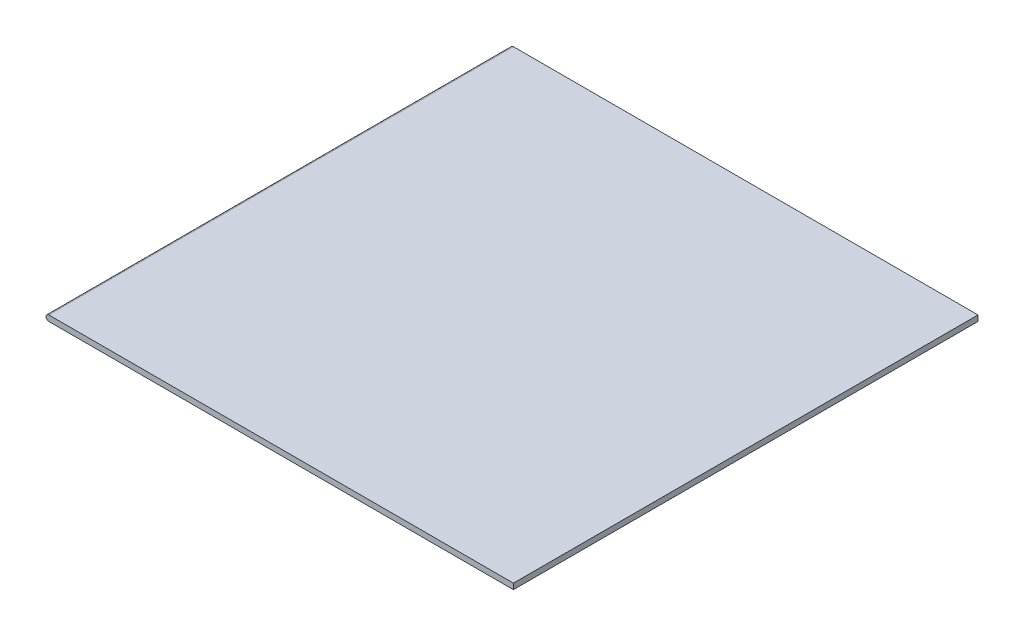
ISO-10303-21;
HEADER;
FILE_DESCRIPTION(('STEP AP214'),'2;1');
FILE_NAME('part.step','',(''),(''),'','','');
FILE_SCHEMA(('AUTOMOTIVE_DESIGN { 1 0 10303 214 1 1 1 1 }'));
ENDSEC;
DATA;
#1=APPLICATION_CONTEXT('core data for automotive mechanical design processes');
#2=APPLICATION_PROTOCOL_DEFINITION('international standard','automotive_design',2000,#1);
#3=PRODUCT_CONTEXT('',#1,'mechanical');
#4=PRODUCT('Part','Part','',(#3));
#5=PRODUCT_RELATED_PRODUCT_CATEGORY('part','',(#4));
#6=PRODUCT_DEFINITION_FORMATION('','',#4);
#7=PRODUCT_DEFINITION_CONTEXT('part definition',#1,'design');
#8=PRODUCT_DEFINITION('design','',#6,#7);
#9=PRODUCT_DEFINITION_SHAPE('','',#8);
#10=(LENGTH_UNIT() NAMED_UNIT(*) SI_UNIT(.MILLI.,.METRE.));
#11=(NAMED_UNIT(*) PLANE_ANGLE_UNIT() SI_UNIT($,.RADIAN.));
#12=(NAMED_UNIT(*) SI_UNIT($,.STERADIAN.) SOLID_ANGLE_UNIT());
#13=UNCERTAINTY_MEASURE_WITH_UNIT(LENGTH_MEASURE(1.E-05),#10,'distance_accuracy_value','');
#14=(GEOMETRIC_REPRESENTATION_CONTEXT(3) GLOBAL_UNCERTAINTY_ASSIGNED_CONTEXT((#13)) GLOBAL_UNIT_ASSIGNED_CONTEXT((#10,
#11,#12)) REPRESENTATION_CONTEXT('',''));
#15=CARTESIAN_POINT('',(0.,0.,0.));
#16=DIRECTION('',(0.,0.,1.));
#17=DIRECTION('',(1.,0.,0.));
#18=AXIS2_PLACEMENT_3D('',#15,#16,#17);
#19=CARTESIAN_POINT('',(205.,5.,205.));
#20=DIRECTION('',(-1.,0.,0.));
#21=DIRECTION('',(0.,0.,1.));
#22=AXIS2_PLACEMENT_3D('',#19,#20,#21);
#23=PLANE('',#22);
#24=DIRECTION('',(0.,0.,-1.));
#25=VECTOR('',#24,1.);
#26=CARTESIAN_POINT('',(205.,0.,205.));
#27=LINE('',#26,#25);
#28=CARTESIAN_POINT('',(205.,0.,205.));
#29=VERTEX_POINT('',#28);
#30=CARTESIAN_POINT('',(205.,0.,-205.));
#31=VERTEX_POINT('',#30);
#32=EDGE_CURVE('E92',#29,#31,#27,.T.);
#33=ORIENTED_EDGE('',*,*,#32,.T.);
#34=DIRECTION('',(0.,-1.,0.));
#35=VECTOR('',#34,1.);
#36=CARTESIAN_POINT('',(205.,5.,-205.));
#37=LINE('',#36,#35);
#38=CARTESIAN_POINT('',(205.,5.,-205.));
#39=VERTEX_POINT('',#38);
#40=EDGE_CURVE('E11',#39,#31,#37,.T.);
#41=ORIENTED_EDGE('',*,*,#40,.F.);
#42=DIRECTION('',(0.,0.,-1.));
#43=VECTOR('',#42,1.);
#44=CARTESIAN_POINT('',(205.,5.,205.));
#45=LINE('',#44,#43);
#46=CARTESIAN_POINT('',(205.,5.,205.));
#47=VERTEX_POINT('',#46);
#48=EDGE_CURVE('E93',#47,#39,#45,.T.);
#49=ORIENTED_EDGE('',*,*,#48,.F.);
#50=DIRECTION('',(0.,-1.,0.));
#51=VECTOR('',#50,1.);
#52=CARTESIAN_POINT('',(205.,5.,205.));
#53=LINE('',#52,#51);
#54=EDGE_CURVE('E50',#47,#29,#53,.T.);
#55=ORIENTED_EDGE('',*,*,#54,.T.);
#56=EDGE_LOOP('',(#33,#41,#49,#55));
#57=FACE_BOUND('',#56,.T.);
#58=ADVANCED_FACE('F42',(#57),#23,.F.);
#59=CARTESIAN_POINT('',(-205.,5.,-205.));
#60=DIRECTION('',(0.,0.,1.));
#61=DIRECTION('',(1.,0.,0.));
#62=AXIS2_PLACEMENT_3D('',#59,#60,#61);
#63=PLANE('',#62);
#64=DIRECTION('',(-1.,0.,0.));
#65=VECTOR('',#64,1.);
#66=CARTESIAN_POINT('',(-205.,0.,-205.));
#67=LINE('',#66,#65);
#68=CARTESIAN_POINT('',(-205.,0.,-205.));
#69=VERTEX_POINT('',#68);
#70=EDGE_CURVE('E71',#31,#69,#67,.T.);
#71=ORIENTED_EDGE('',*,*,#70,.T.);
#72=CARTESIAN_POINT('',(-205.,2.5,-205.));
#73=DIRECTION('',(0.,0.,1.));
#74=DIRECTION('',(1.,0.,0.));
#75=AXIS2_PLACEMENT_3D('',#72,#73,#74);
#76=CIRCLE('',#75,2.5);
#77=CARTESIAN_POINT('',(-205.,5.,-205.));
#78=VERTEX_POINT('',#77);
#79=EDGE_CURVE('E100',#78,#69,#76,.T.);
#80=ORIENTED_EDGE('',*,*,#79,.F.);
#81=DIRECTION('',(-1.,0.,0.));
#82=VECTOR('',#81,1.);
#83=CARTESIAN_POINT('',(-205.,5.,-205.));
#84=LINE('',#83,#82);
#85=EDGE_CURVE('E83',#39,#78,#84,.T.);
#86=ORIENTED_EDGE('',*,*,#85,.F.);
#87=ORIENTED_EDGE('',*,*,#40,.T.);
#88=EDGE_LOOP('',(#71,#80,#86,#87));
#89=FACE_BOUND('',#88,.T.);
#90=ADVANCED_FACE('F113',(#89),#63,.F.);
#91=CARTESIAN_POINT('',(-205.,5.,205.));
#92=DIRECTION('',(0.,0.,-1.));
#93=DIRECTION('',(-1.,0.,0.));
#94=AXIS2_PLACEMENT_3D('',#91,#92,#93);
#95=PLANE('',#94);
#96=DIRECTION('',(1.,0.,0.));
#97=VECTOR('',#96,1.);
#98=CARTESIAN_POINT('',(-205.,0.,205.));
#99=LINE('',#98,#97);
#100=CARTESIAN_POINT('',(-205.,0.,205.));
#101=VERTEX_POINT('',#100);
#102=EDGE_CURVE('E78',#101,#29,#99,.T.);
#103=ORIENTED_EDGE('',*,*,#102,.T.);
#104=ORIENTED_EDGE('',*,*,#54,.F.);
#105=DIRECTION('',(1.,0.,0.));
#106=VECTOR('',#105,1.);
#107=CARTESIAN_POINT('',(-205.,5.,205.));
#108=LINE('',#107,#106);
#109=CARTESIAN_POINT('',(-205.,5.,205.));
#110=VERTEX_POINT('',#109);
#111=EDGE_CURVE('E58',#110,#47,#108,.T.);
#112=ORIENTED_EDGE('',*,*,#111,.F.);
#113=CARTESIAN_POINT('',(-205.,2.5,205.));
#114=DIRECTION('',(0.,0.,1.));
#115=DIRECTION('',(1.,0.,0.));
#116=AXIS2_PLACEMENT_3D('',#113,#114,#115);
#117=CIRCLE('',#116,2.5);
#118=EDGE_CURVE('E96',#110,#101,#117,.T.);
#119=ORIENTED_EDGE('',*,*,#118,.T.);
#120=EDGE_LOOP('',(#103,#104,#112,#119));
#121=FACE_BOUND('',#120,.T.);
#122=ADVANCED_FACE('F97',(#121),#95,.F.);
#123=CARTESIAN_POINT('',(0.,5.,0.));
#124=DIRECTION('',(0.,-1.,0.));
#125=DIRECTION('',(0.,0.,-1.));
#126=AXIS2_PLACEMENT_3D('',#123,#124,#125);
#127=PLANE('',#126);
#128=ORIENTED_EDGE('',*,*,#48,.T.);
#129=ORIENTED_EDGE('',*,*,#85,.T.);
#130=DIRECTION('',(0.,0.,1.));
#131=VECTOR('',#130,1.);
#132=CARTESIAN_POINT('',(-205.,5.,205.));
#133=LINE('',#132,#131);
#134=EDGE_CURVE('E108',#78,#110,#133,.T.);
#135=ORIENTED_EDGE('',*,*,#134,.T.);
#136=ORIENTED_EDGE('',*,*,#111,.T.);
#137=EDGE_LOOP('',(#128,#129,#135,#136));
#138=FACE_BOUND('',#137,.T.);
#139=ADVANCED_FACE('F119',(#138),#127,.F.);
#140=CARTESIAN_POINT('',(0.,0.,0.));
#141=DIRECTION('',(0.,-1.,0.));
#142=DIRECTION('',(0.,0.,-1.));
#143=AXIS2_PLACEMENT_3D('',#140,#141,#142);
#144=PLANE('',#143);
#145=ORIENTED_EDGE('',*,*,#32,.F.);
#146=ORIENTED_EDGE('',*,*,#102,.F.);
#147=DIRECTION('',(0.,0.,1.));
#148=VECTOR('',#147,1.);
#149=CARTESIAN_POINT('',(-205.,0.,205.));
#150=LINE('',#149,#148);
#151=EDGE_CURVE('E89',#69,#101,#150,.T.);
#152=ORIENTED_EDGE('',*,*,#151,.F.);
#153=ORIENTED_EDGE('',*,*,#70,.F.);
#154=EDGE_LOOP('',(#145,#146,#152,#153));
#155=FACE_BOUND('',#154,.T.);
#156=ADVANCED_FACE('F87',(#155),#144,.T.);
#157=CARTESIAN_POINT('',(-205.,2.5,205.));
#158=DIRECTION('',(0.,0.,-1.));
#159=DIRECTION('',(-1.,0.,0.));
#160=AXIS2_PLACEMENT_3D('',#157,#158,#159);
#161=CYLINDRICAL_SURFACE('',#160,2.5);
#162=ORIENTED_EDGE('',*,*,#134,.F.);
#163=ORIENTED_EDGE('',*,*,#79,.T.);
#164=ORIENTED_EDGE('',*,*,#151,.T.);
#165=ORIENTED_EDGE('',*,*,#118,.F.);
#166=EDGE_LOOP('',(#162,#163,#164,#165));
#167=FACE_BOUND('',#166,.T.);
#168=ADVANCED_FACE('F102',(#167),#161,.T.);
#169=CLOSED_SHELL('',(#58,#90,#122,#139,#156,#168));
#170=MANIFOLD_SOLID_BREP('B2',#169);
#171=ADVANCED_BREP_SHAPE_REPRESENTATION('',(#18,#170),#14);
#172=SHAPE_DEFINITION_REPRESENTATION(#9,#171);
ENDSEC;
END-ISO-10303-21;
